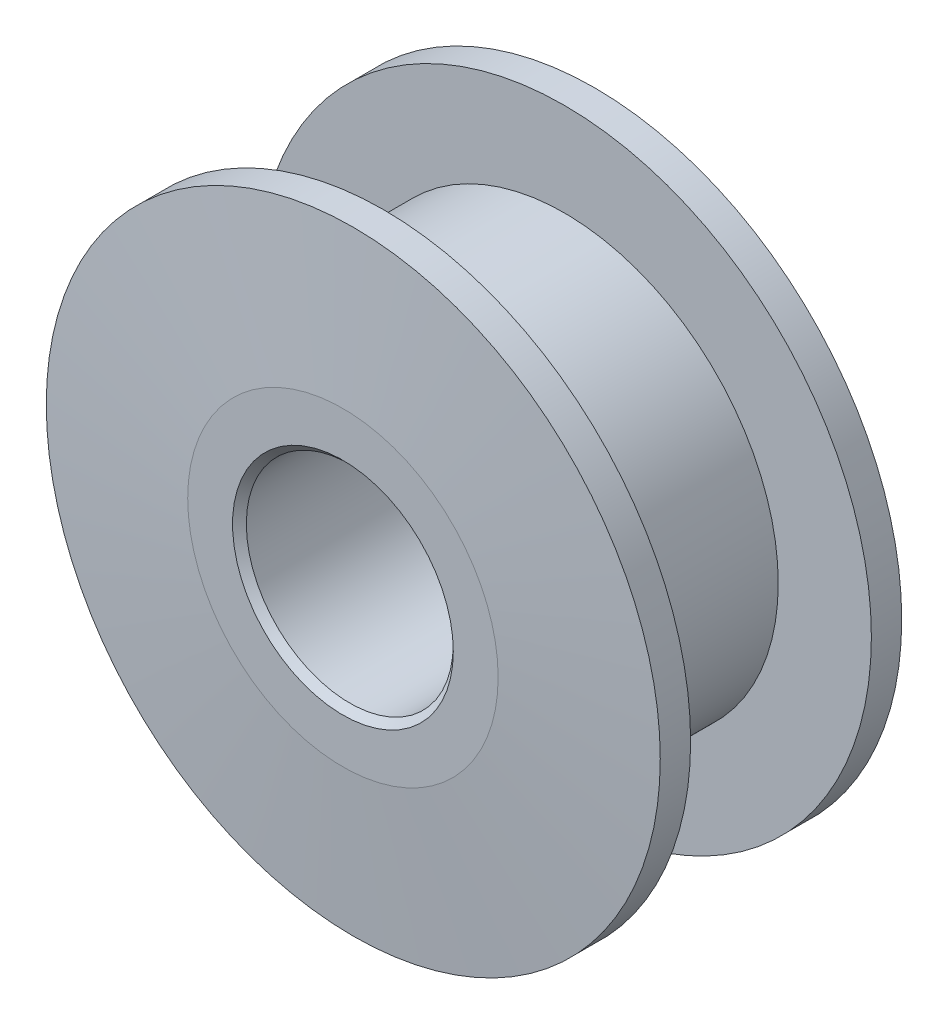
ISO-10303-21;
HEADER;
FILE_DESCRIPTION(('STEP AP214'),'2;1');
FILE_NAME('part.step','',(''),(''),'','','');
FILE_SCHEMA(('AUTOMOTIVE_DESIGN { 1 0 10303 214 1 1 1 1 }'));
ENDSEC;
DATA;
#1=APPLICATION_CONTEXT('core data for automotive mechanical design processes');
#2=APPLICATION_PROTOCOL_DEFINITION('international standard','automotive_design',2000,#1);
#3=PRODUCT_CONTEXT('',#1,'mechanical');
#4=PRODUCT('Part','Part','',(#3));
#5=PRODUCT_RELATED_PRODUCT_CATEGORY('part','',(#4));
#6=PRODUCT_DEFINITION_FORMATION('','',#4);
#7=PRODUCT_DEFINITION_CONTEXT('part definition',#1,'design');
#8=PRODUCT_DEFINITION('design','',#6,#7);
#9=PRODUCT_DEFINITION_SHAPE('','',#8);
#10=(LENGTH_UNIT() NAMED_UNIT(*) SI_UNIT(.MILLI.,.METRE.));
#11=(NAMED_UNIT(*) PLANE_ANGLE_UNIT() SI_UNIT($,.RADIAN.));
#12=(NAMED_UNIT(*) SI_UNIT($,.STERADIAN.) SOLID_ANGLE_UNIT());
#13=UNCERTAINTY_MEASURE_WITH_UNIT(LENGTH_MEASURE(1.E-05),#10,'distance_accuracy_value','');
#14=(GEOMETRIC_REPRESENTATION_CONTEXT(3) GLOBAL_UNCERTAINTY_ASSIGNED_CONTEXT((#13)) GLOBAL_UNIT_ASSIGNED_CONTEXT((#10,
#11,#12)) REPRESENTATION_CONTEXT('',''));
#15=CARTESIAN_POINT('',(0.,0.,0.));
#16=DIRECTION('',(0.,0.,1.));
#17=DIRECTION('',(1.,0.,0.));
#18=AXIS2_PLACEMENT_3D('',#15,#16,#17);
#19=CARTESIAN_POINT('',(0.,0.,1.9));
#20=DIRECTION('',(0.,0.,-1.));
#21=DIRECTION('',(-1.,0.,0.));
#22=AXIS2_PLACEMENT_3D('',#19,#20,#21);
#23=CYLINDRICAL_SURFACE('',#22,4.45);
#24=CARTESIAN_POINT('',(0.,0.,-1.75));
#25=DIRECTION('',(0.,0.,1.));
#26=DIRECTION('',(1.,0.,0.));
#27=AXIS2_PLACEMENT_3D('',#24,#25,#26);
#28=CIRCLE('',#27,4.45);
#29=CARTESIAN_POINT('',(-4.45,0.,-1.75));
#30=VERTEX_POINT('',#29);
#31=EDGE_CURVE('E66',#30,#30,#28,.T.);
#32=CARTESIAN_POINT('',(0.,0.,-1.31));
#33=DIRECTION('',(0.,0.,1.));
#34=DIRECTION('',(1.,0.,0.));
#35=AXIS2_PLACEMENT_3D('',#32,#33,#34);
#36=CIRCLE('',#35,4.45);
#37=CARTESIAN_POINT('',(-4.45,0.,-1.31));
#38=VERTEX_POINT('',#37);
#39=EDGE_CURVE('E69',#38,#38,#36,.T.);
#40=CARTESIAN_POINT('',(-4.45,0.,-1.75));
#41=CARTESIAN_POINT('',(-4.45,0.,-1.74541666666667));
#42=CARTESIAN_POINT('',(-4.45,0.,-1.74083333333333));
#43=CARTESIAN_POINT('',(-4.45,0.,-1.73166666666667));
#44=CARTESIAN_POINT('',(-4.45,0.,-1.72708333333333));
#45=CARTESIAN_POINT('',(-4.45,0.,-1.71791666666667));
#46=CARTESIAN_POINT('',(-4.45,0.,-1.71333333333333));
#47=CARTESIAN_POINT('',(-4.45,0.,-1.70416666666667));
#48=CARTESIAN_POINT('',(-4.45,0.,-1.69958333333333));
#49=CARTESIAN_POINT('',(-4.45,0.,-1.69041666666667));
#50=CARTESIAN_POINT('',(-4.45,0.,-1.68583333333333));
#51=CARTESIAN_POINT('',(-4.45,0.,-1.67666666666667));
#52=CARTESIAN_POINT('',(-4.45,0.,-1.67208333333333));
#53=CARTESIAN_POINT('',(-4.45,0.,-1.66291666666667));
#54=CARTESIAN_POINT('',(-4.45,0.,-1.65833333333333));
#55=CARTESIAN_POINT('',(-4.45,0.,-1.64916666666667));
#56=CARTESIAN_POINT('',(-4.45,0.,-1.64458333333333));
#57=CARTESIAN_POINT('',(-4.45,0.,-1.63541666666667));
#58=CARTESIAN_POINT('',(-4.45,0.,-1.63083333333333));
#59=CARTESIAN_POINT('',(-4.45,0.,-1.62166666666667));
#60=CARTESIAN_POINT('',(-4.45,0.,-1.61708333333333));
#61=CARTESIAN_POINT('',(-4.45,0.,-1.60791666666667));
#62=CARTESIAN_POINT('',(-4.45,0.,-1.60333333333333));
#63=CARTESIAN_POINT('',(-4.45,0.,-1.59416666666667));
#64=CARTESIAN_POINT('',(-4.45,0.,-1.58958333333333));
#65=CARTESIAN_POINT('',(-4.45,0.,-1.58041666666667));
#66=CARTESIAN_POINT('',(-4.45,0.,-1.57583333333333));
#67=CARTESIAN_POINT('',(-4.45,0.,-1.56666666666667));
#68=CARTESIAN_POINT('',(-4.45,0.,-1.56208333333333));
#69=CARTESIAN_POINT('',(-4.45,0.,-1.55291666666667));
#70=CARTESIAN_POINT('',(-4.45,0.,-1.54833333333333));
#71=CARTESIAN_POINT('',(-4.45,0.,-1.53916666666667));
#72=CARTESIAN_POINT('',(-4.45,0.,-1.53458333333333));
#73=CARTESIAN_POINT('',(-4.45,0.,-1.52541666666667));
#74=CARTESIAN_POINT('',(-4.45,0.,-1.52083333333333));
#75=CARTESIAN_POINT('',(-4.45,0.,-1.51166666666667));
#76=CARTESIAN_POINT('',(-4.45,0.,-1.50708333333333));
#77=CARTESIAN_POINT('',(-4.45,0.,-1.49791666666667));
#78=CARTESIAN_POINT('',(-4.45,0.,-1.49333333333333));
#79=CARTESIAN_POINT('',(-4.45,0.,-1.48416666666667));
#80=CARTESIAN_POINT('',(-4.45,0.,-1.47958333333333));
#81=CARTESIAN_POINT('',(-4.45,0.,-1.47041666666667));
#82=CARTESIAN_POINT('',(-4.45,0.,-1.46583333333333));
#83=CARTESIAN_POINT('',(-4.45,0.,-1.45666666666667));
#84=CARTESIAN_POINT('',(-4.45,0.,-1.45208333333333));
#85=CARTESIAN_POINT('',(-4.45,0.,-1.44291666666667));
#86=CARTESIAN_POINT('',(-4.45,0.,-1.43833333333333));
#87=CARTESIAN_POINT('',(-4.45,0.,-1.42916666666667));
#88=CARTESIAN_POINT('',(-4.45,0.,-1.42458333333333));
#89=CARTESIAN_POINT('',(-4.45,0.,-1.41541666666667));
#90=CARTESIAN_POINT('',(-4.45,0.,-1.41083333333333));
#91=CARTESIAN_POINT('',(-4.45,0.,-1.40166666666667));
#92=CARTESIAN_POINT('',(-4.45,0.,-1.39708333333333));
#93=CARTESIAN_POINT('',(-4.45,0.,-1.38791666666667));
#94=CARTESIAN_POINT('',(-4.45,0.,-1.38333333333333));
#95=CARTESIAN_POINT('',(-4.45,0.,-1.37416666666667));
#96=CARTESIAN_POINT('',(-4.45,0.,-1.36958333333333));
#97=CARTESIAN_POINT('',(-4.45,0.,-1.36041666666667));
#98=CARTESIAN_POINT('',(-4.45,0.,-1.35583333333333));
#99=CARTESIAN_POINT('',(-4.45,0.,-1.34666666666667));
#100=CARTESIAN_POINT('',(-4.45,0.,-1.34208333333333));
#101=CARTESIAN_POINT('',(-4.45,0.,-1.33291666666667));
#102=CARTESIAN_POINT('',(-4.45,0.,-1.32833333333333));
#103=CARTESIAN_POINT('',(-4.45,0.,-1.31916666666667));
#104=CARTESIAN_POINT('',(-4.45,0.,-1.31458333333333));
#105=CARTESIAN_POINT('',(-4.45,0.,-1.31));
#106=B_SPLINE_CURVE_WITH_KNOTS('',3,(#40,#41,#42,#43,#44,#45,#46,#47,#48,#49,#50,#51,#52,#53,
#54,#55,#56,#57,#58,#59,#60,#61,#62,#63,#64,#65,#66,#67,#68,#69,#70,#71,#72,#73,#74,#75,#76,#77,
#78,#79,#80,#81,#82,#83,#84,#85,#86,#87,#88,#89,#90,#91,#92,#93,#94,#95,#96,#97,#98,#99,#100,
#101,#102,#103,#104,#105),.UNSPECIFIED.,.F.,.F.,(4,2,2,2,2,2,2,2,2,2,2,2,2,2,2,2,2,2,2,2,2,2,2,
2,2,2,2,2,2,2,2,2,4),(0.,0.0137499999999999,0.0275000000000002,0.0412500000000001,
0.0549999999999999,0.0687500000000002,0.0825000000000001,0.09625,0.11,0.12375,0.1375,0.15125,
0.165,0.17875,0.1925,0.20625,0.22,0.23375,0.2475,0.26125,0.275,0.28875,0.3025,0.31625,0.33,
0.34375,0.3575,0.37125,0.385,0.39875,0.4125,0.42625,0.44),.UNSPECIFIED.);
#107=EDGE_CURVE('BSEAM36',#30,#38,#106,.T.);
#108=ORIENTED_EDGE('',*,*,#31,.T.);
#109=ORIENTED_EDGE('',*,*,#39,.F.);
#110=ORIENTED_EDGE('',*,*,#107,.T.);
#111=ORIENTED_EDGE('',*,*,#107,.F.);
#112=EDGE_LOOP('',(#108,#110,#109,#111));
#113=FACE_BOUND('',#112,.T.);
#114=ADVANCED_FACE('F36',(#113),#23,.T.);
#115=CARTESIAN_POINT('',(0.,0.,-1.9));
#116=DIRECTION('',(0.,0.,1.));
#117=DIRECTION('',(1.,0.,0.));
#118=AXIS2_PLACEMENT_3D('',#115,#116,#117);
#119=PLANE('',#118);
#120=CARTESIAN_POINT('',(0.,0.,-1.9));
#121=DIRECTION('',(0.,0.,1.));
#122=DIRECTION('',(1.,0.,0.));
#123=AXIS2_PLACEMENT_3D('',#120,#121,#122);
#124=CIRCLE('',#123,1.6);
#125=CARTESIAN_POINT('',(1.6,0.,-1.9));
#126=VERTEX_POINT('',#125);
#127=EDGE_CURVE('E10',#126,#126,#124,.T.);
#128=ORIENTED_EDGE('',*,*,#127,.T.);
#129=EDGE_LOOP('',(#128));
#130=FACE_BOUND('',#129,.T.);
#131=CARTESIAN_POINT('',(0.,0.,-1.9));
#132=DIRECTION('',(0.,0.,1.));
#133=DIRECTION('',(1.,0.,0.));
#134=AXIS2_PLACEMENT_3D('',#131,#132,#133);
#135=CIRCLE('',#134,2.44999999999991);
#136=CARTESIAN_POINT('',(2.44999999999991,0.,-1.9));
#137=VERTEX_POINT('',#136);
#138=EDGE_CURVE('E63',#137,#137,#135,.F.);
#139=ORIENTED_EDGE('',*,*,#138,.T.);
#140=EDGE_LOOP('',(#139));
#141=FACE_BOUND('',#140,.T.);
#142=ADVANCED_FACE('F89',(#130,#141),#119,.F.);
#143=CARTESIAN_POINT('',(0.,0.,-1.31));
#144=DIRECTION('',(0.,0.,1.));
#145=DIRECTION('',(1.,0.,0.));
#146=AXIS2_PLACEMENT_3D('',#143,#144,#145);
#147=PLANE('',#146);
#148=CARTESIAN_POINT('',(0.,0.,-1.31));
#149=DIRECTION('',(0.,0.,1.));
#150=DIRECTION('',(1.,0.,0.));
#151=AXIS2_PLACEMENT_3D('',#148,#149,#150);
#152=CIRCLE('',#151,3.1);
#153=CARTESIAN_POINT('',(3.1,0.,-1.31));
#154=VERTEX_POINT('',#153);
#155=EDGE_CURVE('E73',#154,#154,#152,.T.);
#156=ORIENTED_EDGE('',*,*,#155,.F.);
#157=EDGE_LOOP('',(#156));
#158=FACE_BOUND('',#157,.T.);
#159=ORIENTED_EDGE('',*,*,#39,.T.);
#160=EDGE_LOOP('',(#159));
#161=FACE_BOUND('',#160,.T.);
#162=ADVANCED_FACE('F85',(#158,#161),#147,.T.);
#163=CARTESIAN_POINT('',(0.,0.,1.31));
#164=DIRECTION('',(0.,0.,1.));
#165=DIRECTION('',(1.,0.,0.));
#166=AXIS2_PLACEMENT_3D('',#163,#164,#165);
#167=PLANE('',#166);
#168=CARTESIAN_POINT('',(0.,0.,1.31));
#169=DIRECTION('',(0.,0.,1.));
#170=DIRECTION('',(1.,0.,0.));
#171=AXIS2_PLACEMENT_3D('',#168,#169,#170);
#172=CIRCLE('',#171,3.1);
#173=CARTESIAN_POINT('',(3.1,0.,1.31));
#174=VERTEX_POINT('',#173);
#175=EDGE_CURVE('E76',#174,#174,#172,.T.);
#176=ORIENTED_EDGE('',*,*,#175,.T.);
#177=EDGE_LOOP('',(#176));
#178=FACE_BOUND('',#177,.T.);
#179=CARTESIAN_POINT('',(0.,0.,1.31));
#180=DIRECTION('',(0.,0.,1.));
#181=DIRECTION('',(1.,0.,0.));
#182=AXIS2_PLACEMENT_3D('',#179,#180,#181);
#183=CIRCLE('',#182,4.45);
#184=CARTESIAN_POINT('',(-4.45,0.,1.31));
#185=VERTEX_POINT('',#184);
#186=EDGE_CURVE('E70',#185,#185,#183,.T.);
#187=ORIENTED_EDGE('',*,*,#186,.F.);
#188=EDGE_LOOP('',(#187));
#189=FACE_BOUND('',#188,.T.);
#190=ADVANCED_FACE('F88',(#178,#189),#167,.F.);
#191=CARTESIAN_POINT('',(0.,0.,-1.31));
#192=DIRECTION('',(0.,0.,1.));
#193=DIRECTION('',(1.,0.,0.));
#194=AXIS2_PLACEMENT_3D('',#191,#192,#193);
#195=CYLINDRICAL_SURFACE('',#194,3.1);
#196=ORIENTED_EDGE('',*,*,#155,.T.);
#197=EDGE_LOOP('',(#196));
#198=FACE_BOUND('',#197,.T.);
#199=ORIENTED_EDGE('',*,*,#175,.F.);
#200=EDGE_LOOP('',(#199));
#201=FACE_BOUND('',#200,.T.);
#202=ADVANCED_FACE('F82',(#198,#201),#195,.T.);
#203=CARTESIAN_POINT('',(0.,0.,1.9));
#204=DIRECTION('',(0.,0.,1.));
#205=DIRECTION('',(1.,0.,0.));
#206=AXIS2_PLACEMENT_3D('',#203,#204,#205);
#207=PLANE('',#206);
#208=CARTESIAN_POINT('',(0.,0.,1.9));
#209=DIRECTION('',(0.,0.,1.));
#210=DIRECTION('',(1.,0.,0.));
#211=AXIS2_PLACEMENT_3D('',#208,#209,#210);
#212=CIRCLE('',#211,1.6);
#213=CARTESIAN_POINT('',(1.6,0.,1.9));
#214=VERTEX_POINT('',#213);
#215=EDGE_CURVE('E44',#214,#214,#212,.F.);
#216=ORIENTED_EDGE('',*,*,#215,.T.);
#217=EDGE_LOOP('',(#216));
#218=FACE_BOUND('',#217,.T.);
#219=CARTESIAN_POINT('',(0.,0.,1.9));
#220=DIRECTION('',(0.,0.,1.));
#221=DIRECTION('',(1.,0.,0.));
#222=AXIS2_PLACEMENT_3D('',#219,#220,#221);
#223=CIRCLE('',#222,2.24999999999989);
#224=CARTESIAN_POINT('',(2.24999999999989,0.,1.9));
#225=VERTEX_POINT('',#224);
#226=EDGE_CURVE('E60',#225,#225,#223,.T.);
#227=ORIENTED_EDGE('',*,*,#226,.T.);
#228=EDGE_LOOP('',(#227));
#229=FACE_BOUND('',#228,.T.);
#230=ADVANCED_FACE('F104',(#218,#229),#207,.T.);
#231=CARTESIAN_POINT('',(0.,0.,1.75));
#232=DIRECTION('',(0.,0.,1.));
#233=DIRECTION('',(1.,0.,0.));
#234=AXIS2_PLACEMENT_3D('',#231,#232,#233);
#235=CIRCLE('',#234,4.45);
#236=CARTESIAN_POINT('',(-4.45,0.,1.75));
#237=VERTEX_POINT('',#236);
#238=EDGE_CURVE('E57',#237,#237,#235,.F.);
#239=CARTESIAN_POINT('',(-4.45,0.,1.75));
#240=CARTESIAN_POINT('',(-4.45,0.,1.74541666666667));
#241=CARTESIAN_POINT('',(-4.45,0.,1.74083333333333));
#242=CARTESIAN_POINT('',(-4.45,0.,1.73166666666667));
#243=CARTESIAN_POINT('',(-4.45,0.,1.72708333333333));
#244=CARTESIAN_POINT('',(-4.45,0.,1.71791666666667));
#245=CARTESIAN_POINT('',(-4.45,0.,1.71333333333333));
#246=CARTESIAN_POINT('',(-4.45,0.,1.70416666666667));
#247=CARTESIAN_POINT('',(-4.45,0.,1.69958333333333));
#248=CARTESIAN_POINT('',(-4.45,0.,1.69041666666667));
#249=CARTESIAN_POINT('',(-4.45,0.,1.68583333333333));
#250=CARTESIAN_POINT('',(-4.45,0.,1.67666666666667));
#251=CARTESIAN_POINT('',(-4.45,0.,1.67208333333333));
#252=CARTESIAN_POINT('',(-4.45,0.,1.66291666666667));
#253=CARTESIAN_POINT('',(-4.45,0.,1.65833333333333));
#254=CARTESIAN_POINT('',(-4.45,0.,1.64916666666667));
#255=CARTESIAN_POINT('',(-4.45,0.,1.64458333333333));
#256=CARTESIAN_POINT('',(-4.45,0.,1.63541666666667));
#257=CARTESIAN_POINT('',(-4.45,0.,1.63083333333333));
#258=CARTESIAN_POINT('',(-4.45,0.,1.62166666666667));
#259=CARTESIAN_POINT('',(-4.45,0.,1.61708333333333));
#260=CARTESIAN_POINT('',(-4.45,0.,1.60791666666667));
#261=CARTESIAN_POINT('',(-4.45,0.,1.60333333333333));
#262=CARTESIAN_POINT('',(-4.45,0.,1.59416666666667));
#263=CARTESIAN_POINT('',(-4.45,0.,1.58958333333333));
#264=CARTESIAN_POINT('',(-4.45,0.,1.58041666666667));
#265=CARTESIAN_POINT('',(-4.45,0.,1.57583333333333));
#266=CARTESIAN_POINT('',(-4.45,0.,1.56666666666667));
#267=CARTESIAN_POINT('',(-4.45,0.,1.56208333333333));
#268=CARTESIAN_POINT('',(-4.45,0.,1.55291666666667));
#269=CARTESIAN_POINT('',(-4.45,0.,1.54833333333333));
#270=CARTESIAN_POINT('',(-4.45,0.,1.53916666666667));
#271=CARTESIAN_POINT('',(-4.45,0.,1.53458333333333));
#272=CARTESIAN_POINT('',(-4.45,0.,1.52541666666667));
#273=CARTESIAN_POINT('',(-4.45,0.,1.52083333333333));
#274=CARTESIAN_POINT('',(-4.45,0.,1.51166666666667));
#275=CARTESIAN_POINT('',(-4.45,0.,1.50708333333333));
#276=CARTESIAN_POINT('',(-4.45,0.,1.49791666666667));
#277=CARTESIAN_POINT('',(-4.45,0.,1.49333333333333));
#278=CARTESIAN_POINT('',(-4.45,0.,1.48416666666667));
#279=CARTESIAN_POINT('',(-4.45,0.,1.47958333333333));
#280=CARTESIAN_POINT('',(-4.45,0.,1.47041666666667));
#281=CARTESIAN_POINT('',(-4.45,0.,1.46583333333333));
#282=CARTESIAN_POINT('',(-4.45,0.,1.45666666666667));
#283=CARTESIAN_POINT('',(-4.45,0.,1.45208333333333));
#284=CARTESIAN_POINT('',(-4.45,0.,1.44291666666667));
#285=CARTESIAN_POINT('',(-4.45,0.,1.43833333333333));
#286=CARTESIAN_POINT('',(-4.45,0.,1.42916666666667));
#287=CARTESIAN_POINT('',(-4.45,0.,1.42458333333333));
#288=CARTESIAN_POINT('',(-4.45,0.,1.41541666666667));
#289=CARTESIAN_POINT('',(-4.45,0.,1.41083333333333));
#290=CARTESIAN_POINT('',(-4.45,0.,1.40166666666667));
#291=CARTESIAN_POINT('',(-4.45,0.,1.39708333333333));
#292=CARTESIAN_POINT('',(-4.45,0.,1.38791666666667));
#293=CARTESIAN_POINT('',(-4.45,0.,1.38333333333333));
#294=CARTESIAN_POINT('',(-4.45,0.,1.37416666666667));
#295=CARTESIAN_POINT('',(-4.45,0.,1.36958333333333));
#296=CARTESIAN_POINT('',(-4.45,0.,1.36041666666667));
#297=CARTESIAN_POINT('',(-4.45,0.,1.35583333333333));
#298=CARTESIAN_POINT('',(-4.45,0.,1.34666666666667));
#299=CARTESIAN_POINT('',(-4.45,0.,1.34208333333333));
#300=CARTESIAN_POINT('',(-4.45,0.,1.33291666666667));
#301=CARTESIAN_POINT('',(-4.45,0.,1.32833333333333));
#302=CARTESIAN_POINT('',(-4.45,0.,1.31916666666667));
#303=CARTESIAN_POINT('',(-4.45,0.,1.31458333333333));
#304=CARTESIAN_POINT('',(-4.45,0.,1.31));
#305=B_SPLINE_CURVE_WITH_KNOTS('',3,(#239,#240,#241,#242,#243,#244,#245,#246,#247,#248,#249,
#250,#251,#252,#253,#254,#255,#256,#257,#258,#259,#260,#261,#262,#263,#264,#265,#266,#267,#268,
#269,#270,#271,#272,#273,#274,#275,#276,#277,#278,#279,#280,#281,#282,#283,#284,#285,#286,#287,
#288,#289,#290,#291,#292,#293,#294,#295,#296,#297,#298,#299,#300,#301,#302,#303,#304),
.UNSPECIFIED.,.F.,.F.,(4,2,2,2,2,2,2,2,2,2,2,2,2,2,2,2,2,2,2,2,2,2,2,2,2,2,2,2,2,2,2,2,4),(0.,
0.0137499999999999,0.0275,0.0412499999999998,0.0549999999999999,0.06875,0.0824999999999999,
0.0962499999999998,0.11,0.12375,0.1375,0.15125,0.165,0.17875,0.1925,0.20625,0.22,0.23375,0.2475,
0.26125,0.275,0.28875,0.3025,0.31625,0.33,0.34375,0.3575,0.37125,0.385,0.39875,0.4125,0.42625,
0.44),.UNSPECIFIED.);
#306=EDGE_CURVE('BSEAM96',#237,#185,#305,.T.);
#307=ORIENTED_EDGE('',*,*,#238,.T.);
#308=ORIENTED_EDGE('',*,*,#186,.T.);
#309=ORIENTED_EDGE('',*,*,#306,.T.);
#310=ORIENTED_EDGE('',*,*,#306,.F.);
#311=EDGE_LOOP('',(#307,#309,#308,#310));
#312=FACE_BOUND('',#311,.T.);
#313=ADVANCED_FACE('F96',(#312),#23,.T.);
#314=CARTESIAN_POINT('',(0.,0.,-1.75));
#315=DIRECTION('',(0.,0.,1.));
#316=DIRECTION('',(1.,0.,0.));
#317=AXIS2_PLACEMENT_3D('',#314,#315,#316);
#318=CONICAL_SURFACE('',#317,4.45,1.49593647908413);
#319=ORIENTED_EDGE('',*,*,#138,.F.);
#320=EDGE_LOOP('',(#319));
#321=FACE_BOUND('',#320,.T.);
#322=ORIENTED_EDGE('',*,*,#31,.F.);
#323=EDGE_LOOP('',(#322));
#324=FACE_BOUND('',#323,.T.);
#325=ADVANCED_FACE('F103',(#321,#324),#318,.T.);
#326=CARTESIAN_POINT('',(0.,0.,1.9));
#327=DIRECTION('',(0.,0.,-1.));
#328=DIRECTION('',(-1.,0.,0.));
#329=AXIS2_PLACEMENT_3D('',#326,#327,#328);
#330=CONICAL_SURFACE('',#329,2.24999999999989,1.5027198685369);
#331=ORIENTED_EDGE('',*,*,#238,.F.);
#332=EDGE_LOOP('',(#331));
#333=FACE_BOUND('',#332,.T.);
#334=ORIENTED_EDGE('',*,*,#226,.F.);
#335=EDGE_LOOP('',(#334));
#336=FACE_BOUND('',#335,.T.);
#337=ADVANCED_FACE('F110',(#333,#336),#330,.T.);
#338=CARTESIAN_POINT('',(0.,0.,8.1));
#339=DIRECTION('',(0.,0.,-1.));
#340=DIRECTION('',(-1.,0.,0.));
#341=AXIS2_PLACEMENT_3D('',#338,#339,#340);
#342=CYLINDRICAL_SURFACE('',#341,1.5);
#343=CARTESIAN_POINT('',(0.,0.,1.8));
#344=DIRECTION('',(0.,0.,1.));
#345=DIRECTION('',(1.,0.,0.));
#346=AXIS2_PLACEMENT_3D('',#343,#344,#345);
#347=CIRCLE('',#346,1.5);
#348=CARTESIAN_POINT('',(1.5,0.,1.8));
#349=VERTEX_POINT('',#348);
#350=EDGE_CURVE('E48',#349,#349,#347,.T.);
#351=ORIENTED_EDGE('',*,*,#350,.T.);
#352=EDGE_LOOP('',(#351));
#353=FACE_BOUND('',#352,.T.);
#354=CARTESIAN_POINT('',(0.,0.,-1.8));
#355=DIRECTION('',(0.,0.,1.));
#356=DIRECTION('',(1.,0.,0.));
#357=AXIS2_PLACEMENT_3D('',#354,#355,#356);
#358=CIRCLE('',#357,1.5);
#359=CARTESIAN_POINT('',(1.5,0.,-1.8));
#360=VERTEX_POINT('',#359);
#361=EDGE_CURVE('E52',#360,#360,#358,.F.);
#362=ORIENTED_EDGE('',*,*,#361,.T.);
#363=EDGE_LOOP('',(#362));
#364=FACE_BOUND('',#363,.T.);
#365=ADVANCED_FACE('F125',(#353,#364),#342,.F.);
#366=CARTESIAN_POINT('',(0.,0.,1.8));
#367=DIRECTION('',(0.,0.,1.));
#368=DIRECTION('',(1.,0.,0.));
#369=AXIS2_PLACEMENT_3D('',#366,#367,#368);
#370=CONICAL_SURFACE('',#369,1.5,0.785398163397449);
#371=ORIENTED_EDGE('',*,*,#215,.F.);
#372=EDGE_LOOP('',(#371));
#373=FACE_BOUND('',#372,.T.);
#374=ORIENTED_EDGE('',*,*,#350,.F.);
#375=EDGE_LOOP('',(#374));
#376=FACE_BOUND('',#375,.T.);
#377=ADVANCED_FACE('F127',(#373,#376),#370,.F.);
#378=CARTESIAN_POINT('',(0.,0.,-1.8));
#379=DIRECTION('',(0.,0.,-1.));
#380=DIRECTION('',(-1.,0.,0.));
#381=AXIS2_PLACEMENT_3D('',#378,#379,#380);
#382=CONICAL_SURFACE('',#381,1.5,0.785398163397445);
#383=ORIENTED_EDGE('',*,*,#127,.F.);
#384=EDGE_LOOP('',(#383));
#385=FACE_BOUND('',#384,.T.);
#386=ORIENTED_EDGE('',*,*,#361,.F.);
#387=EDGE_LOOP('',(#386));
#388=FACE_BOUND('',#387,.T.);
#389=ADVANCED_FACE('F39',(#385,#388),#382,.F.);
#390=CLOSED_SHELL('',(#114,#142,#162,#190,#202,#230,#313,#325,#337,#365,#377,#389));
#391=MANIFOLD_SOLID_BREP('B2',#390);
#392=ADVANCED_BREP_SHAPE_REPRESENTATION('',(#18,#391),#14);
#393=SHAPE_DEFINITION_REPRESENTATION(#9,#392);
ENDSEC;
END-ISO-10303-21;
